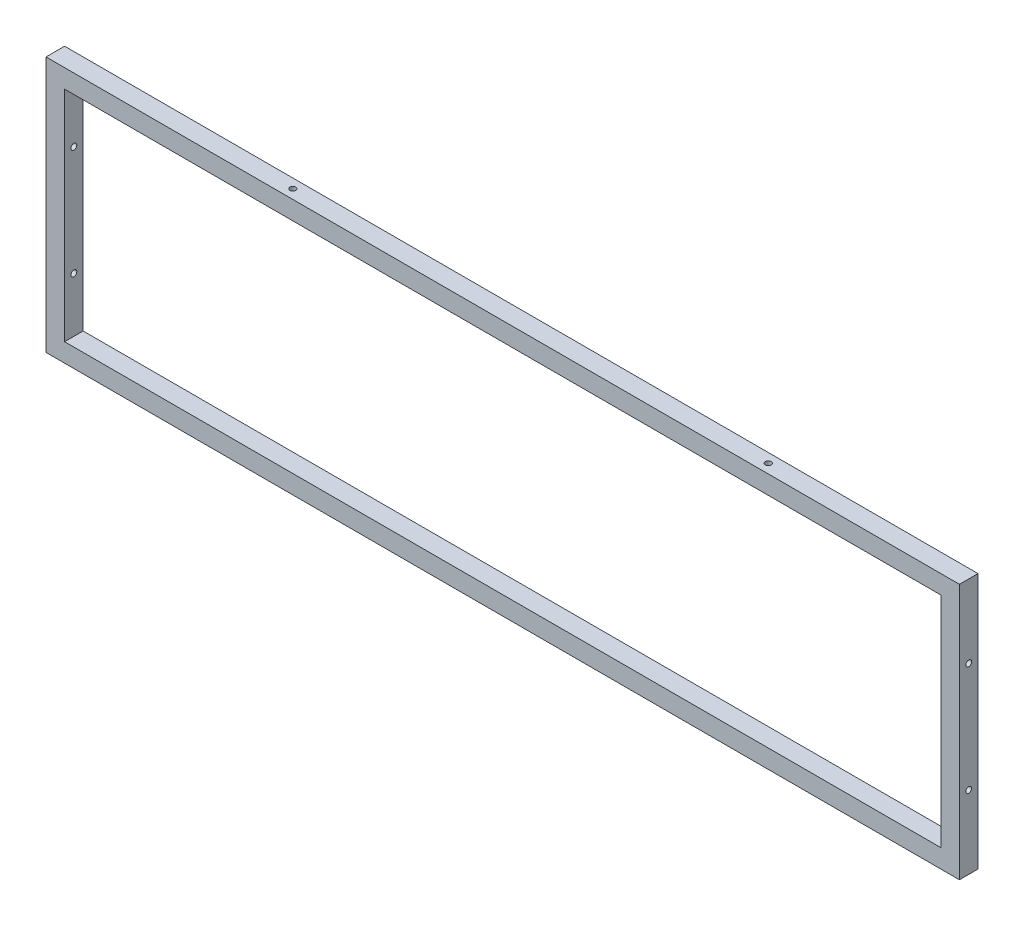
ISO-10303-21;
HEADER;
FILE_DESCRIPTION(('STEP AP214'),'2;1');
FILE_NAME('part.step','',(''),(''),'','','');
FILE_SCHEMA(('AUTOMOTIVE_DESIGN { 1 0 10303 214 1 1 1 1 }'));
ENDSEC;
DATA;
#1=APPLICATION_CONTEXT('core data for automotive mechanical design processes');
#2=APPLICATION_PROTOCOL_DEFINITION('international standard','automotive_design',2000,#1);
#3=PRODUCT_CONTEXT('',#1,'mechanical');
#4=PRODUCT('Part','Part','',(#3));
#5=PRODUCT_RELATED_PRODUCT_CATEGORY('part','',(#4));
#6=PRODUCT_DEFINITION_FORMATION('','',#4);
#7=PRODUCT_DEFINITION_CONTEXT('part definition',#1,'design');
#8=PRODUCT_DEFINITION('design','',#6,#7);
#9=PRODUCT_DEFINITION_SHAPE('','',#8);
#10=(LENGTH_UNIT() NAMED_UNIT(*) SI_UNIT(.MILLI.,.METRE.));
#11=(NAMED_UNIT(*) PLANE_ANGLE_UNIT() SI_UNIT($,.RADIAN.));
#12=(NAMED_UNIT(*) SI_UNIT($,.STERADIAN.) SOLID_ANGLE_UNIT());
#13=UNCERTAINTY_MEASURE_WITH_UNIT(LENGTH_MEASURE(1.E-05),#10,'distance_accuracy_value','');
#14=(GEOMETRIC_REPRESENTATION_CONTEXT(3) GLOBAL_UNCERTAINTY_ASSIGNED_CONTEXT((#13)) GLOBAL_UNIT_ASSIGNED_CONTEXT((#10,
#11,#12)) REPRESENTATION_CONTEXT('',''));
#15=CARTESIAN_POINT('',(0.,0.,0.));
#16=DIRECTION('',(0.,0.,1.));
#17=DIRECTION('',(1.,0.,0.));
#18=AXIS2_PLACEMENT_3D('',#15,#16,#17);
#19=CARTESIAN_POINT('',(0.,0.,-25.4));
#20=DIRECTION('',(-1.,0.,0.));
#21=DIRECTION('',(0.,-1.,0.));
#22=AXIS2_PLACEMENT_3D('',#19,#20,#21);
#23=PLANE('',#22);
#24=CARTESIAN_POINT('',(0.,-100.,-12.7));
#25=DIRECTION('',(1.,0.,0.));
#26=DIRECTION('',(0.,0.,-1.));
#27=AXIS2_PLACEMENT_3D('',#24,#25,#26);
#28=CIRCLE('',#27,4.);
#29=CARTESIAN_POINT('',(0.,-100.,-16.7));
#30=VERTEX_POINT('',#29);
#31=EDGE_CURVE('E172',#30,#30,#28,.T.);
#32=ORIENTED_EDGE('',*,*,#31,.T.);
#33=EDGE_LOOP('',(#32));
#34=FACE_BOUND('',#33,.T.);
#35=CARTESIAN_POINT('',(0.,-250.,-12.7));
#36=DIRECTION('',(1.,0.,0.));
#37=DIRECTION('',(0.,0.,-1.));
#38=AXIS2_PLACEMENT_3D('',#35,#36,#37);
#39=CIRCLE('',#38,4.);
#40=CARTESIAN_POINT('',(0.,-250.,-16.7));
#41=VERTEX_POINT('',#40);
#42=EDGE_CURVE('E179',#41,#41,#39,.T.);
#43=ORIENTED_EDGE('',*,*,#42,.T.);
#44=EDGE_LOOP('',(#43));
#45=FACE_BOUND('',#44,.T.);
#46=DIRECTION('',(0.,-1.,0.));
#47=VECTOR('',#46,1.);
#48=CARTESIAN_POINT('',(0.,0.,0.));
#49=LINE('',#48,#47);
#50=CARTESIAN_POINT('',(0.,0.,0.));
#51=VERTEX_POINT('',#50);
#52=CARTESIAN_POINT('',(0.,-350.,0.));
#53=VERTEX_POINT('',#52);
#54=EDGE_CURVE('E138',#51,#53,#49,.T.);
#55=ORIENTED_EDGE('',*,*,#54,.F.);
#56=DIRECTION('',(0.,0.,1.));
#57=VECTOR('',#56,1.);
#58=CARTESIAN_POINT('',(0.,0.,-25.4));
#59=LINE('',#58,#57);
#60=CARTESIAN_POINT('',(0.,0.,-25.4));
#61=VERTEX_POINT('',#60);
#62=EDGE_CURVE('E11',#61,#51,#59,.T.);
#63=ORIENTED_EDGE('',*,*,#62,.F.);
#64=DIRECTION('',(0.,-1.,0.));
#65=VECTOR('',#64,1.);
#66=CARTESIAN_POINT('',(0.,0.,-25.4));
#67=LINE('',#66,#65);
#68=CARTESIAN_POINT('',(0.,-350.,-25.4));
#69=VERTEX_POINT('',#68);
#70=EDGE_CURVE('E142',#61,#69,#67,.T.);
#71=ORIENTED_EDGE('',*,*,#70,.T.);
#72=DIRECTION('',(0.,0.,1.));
#73=VECTOR('',#72,1.);
#74=CARTESIAN_POINT('',(0.,-350.,-25.4));
#75=LINE('',#74,#73);
#76=EDGE_CURVE('E155',#69,#53,#75,.T.);
#77=ORIENTED_EDGE('',*,*,#76,.T.);
#78=EDGE_LOOP('',(#55,#63,#71,#77));
#79=FACE_BOUND('',#78,.T.);
#80=ADVANCED_FACE('F36',(#34,#45,#79),#23,.T.);
#81=CARTESIAN_POINT('',(0.,0.,-25.4));
#82=DIRECTION('',(0.,1.,0.));
#83=DIRECTION('',(0.,0.,1.));
#84=AXIS2_PLACEMENT_3D('',#81,#82,#83);
#85=PLANE('',#84);
#86=CARTESIAN_POINT('',(325.,0.,-12.7));
#87=DIRECTION('',(0.,1.,0.));
#88=DIRECTION('',(0.,0.,1.));
#89=AXIS2_PLACEMENT_3D('',#86,#87,#88);
#90=CIRCLE('',#89,3.99999999999999);
#91=CARTESIAN_POINT('',(325.,0.,-8.70000000000001));
#92=VERTEX_POINT('',#91);
#93=EDGE_CURVE('E196',#92,#92,#90,.T.);
#94=ORIENTED_EDGE('',*,*,#93,.F.);
#95=EDGE_LOOP('',(#94));
#96=FACE_BOUND('',#95,.T.);
#97=CARTESIAN_POINT('',(975.054095100927,0.,-12.7));
#98=DIRECTION('',(0.,1.,0.));
#99=DIRECTION('',(0.,0.,1.));
#100=AXIS2_PLACEMENT_3D('',#97,#98,#99);
#101=CIRCLE('',#100,3.99999999999999);
#102=CARTESIAN_POINT('',(975.054095100927,0.,-8.70000000000001));
#103=VERTEX_POINT('',#102);
#104=EDGE_CURVE('E198',#103,#103,#101,.T.);
#105=ORIENTED_EDGE('',*,*,#104,.F.);
#106=EDGE_LOOP('',(#105));
#107=FACE_BOUND('',#106,.T.);
#108=DIRECTION('',(-1.,0.,0.));
#109=VECTOR('',#108,1.);
#110=CARTESIAN_POINT('',(0.,0.,0.));
#111=LINE('',#110,#109);
#112=CARTESIAN_POINT('',(1249.2,0.,0.));
#113=VERTEX_POINT('',#112);
#114=EDGE_CURVE('E146',#113,#51,#111,.T.);
#115=ORIENTED_EDGE('',*,*,#114,.F.);
#116=DIRECTION('',(0.,0.,1.));
#117=VECTOR('',#116,1.);
#118=CARTESIAN_POINT('',(1249.2,0.,-25.4));
#119=LINE('',#118,#117);
#120=CARTESIAN_POINT('',(1249.2,0.,-25.4));
#121=VERTEX_POINT('',#120);
#122=EDGE_CURVE('E44',#121,#113,#119,.T.);
#123=ORIENTED_EDGE('',*,*,#122,.F.);
#124=DIRECTION('',(-1.,0.,0.));
#125=VECTOR('',#124,1.);
#126=CARTESIAN_POINT('',(0.,0.,-25.4));
#127=LINE('',#126,#125);
#128=EDGE_CURVE('E152',#121,#61,#127,.T.);
#129=ORIENTED_EDGE('',*,*,#128,.T.);
#130=ORIENTED_EDGE('',*,*,#62,.T.);
#131=EDGE_LOOP('',(#115,#123,#129,#130));
#132=FACE_BOUND('',#131,.T.);
#133=ADVANCED_FACE('F222',(#96,#107,#132),#85,.T.);
#134=CARTESIAN_POINT('',(1249.2,0.,-25.4));
#135=DIRECTION('',(1.,0.,0.));
#136=DIRECTION('',(0.,0.,-1.));
#137=AXIS2_PLACEMENT_3D('',#134,#135,#136);
#138=PLANE('',#137);
#139=CARTESIAN_POINT('',(1249.2,-100.,-12.7));
#140=DIRECTION('',(1.,0.,0.));
#141=DIRECTION('',(0.,0.,-1.));
#142=AXIS2_PLACEMENT_3D('',#139,#140,#141);
#143=CIRCLE('',#142,4.);
#144=CARTESIAN_POINT('',(1249.2,-100.,-16.7));
#145=VERTEX_POINT('',#144);
#146=EDGE_CURVE('E191',#145,#145,#143,.F.);
#147=ORIENTED_EDGE('',*,*,#146,.T.);
#148=EDGE_LOOP('',(#147));
#149=FACE_BOUND('',#148,.T.);
#150=CARTESIAN_POINT('',(1249.2,-250.,-12.7));
#151=DIRECTION('',(1.,0.,0.));
#152=DIRECTION('',(0.,0.,-1.));
#153=AXIS2_PLACEMENT_3D('',#150,#151,#152);
#154=CIRCLE('',#153,4.);
#155=CARTESIAN_POINT('',(1249.2,-250.,-16.7));
#156=VERTEX_POINT('',#155);
#157=EDGE_CURVE('E176',#156,#156,#154,.F.);
#158=ORIENTED_EDGE('',*,*,#157,.T.);
#159=EDGE_LOOP('',(#158));
#160=FACE_BOUND('',#159,.T.);
#161=DIRECTION('',(0.,1.,0.));
#162=VECTOR('',#161,1.);
#163=CARTESIAN_POINT('',(1249.2,0.,0.));
#164=LINE('',#163,#162);
#165=CARTESIAN_POINT('',(1249.2,-350.,0.));
#166=VERTEX_POINT('',#165);
#167=EDGE_CURVE('E161',#166,#113,#164,.T.);
#168=ORIENTED_EDGE('',*,*,#167,.F.);
#169=DIRECTION('',(0.,0.,1.));
#170=VECTOR('',#169,1.);
#171=CARTESIAN_POINT('',(1249.2,-350.,-25.4));
#172=LINE('',#171,#170);
#173=CARTESIAN_POINT('',(1249.2,-350.,-25.4));
#174=VERTEX_POINT('',#173);
#175=EDGE_CURVE('E167',#174,#166,#172,.T.);
#176=ORIENTED_EDGE('',*,*,#175,.F.);
#177=DIRECTION('',(0.,1.,0.));
#178=VECTOR('',#177,1.);
#179=CARTESIAN_POINT('',(1249.2,0.,-25.4));
#180=LINE('',#179,#178);
#181=EDGE_CURVE('E149',#174,#121,#180,.T.);
#182=ORIENTED_EDGE('',*,*,#181,.T.);
#183=ORIENTED_EDGE('',*,*,#122,.T.);
#184=EDGE_LOOP('',(#168,#176,#182,#183));
#185=FACE_BOUND('',#184,.T.);
#186=ADVANCED_FACE('F226',(#149,#160,#185),#138,.T.);
#187=CARTESIAN_POINT('',(0.,-350.,-25.4));
#188=DIRECTION('',(0.,-1.,0.));
#189=DIRECTION('',(0.,0.,-1.));
#190=AXIS2_PLACEMENT_3D('',#187,#188,#189);
#191=PLANE('',#190);
#192=DIRECTION('',(1.,0.,0.));
#193=VECTOR('',#192,1.);
#194=CARTESIAN_POINT('',(0.,-350.,0.));
#195=LINE('',#194,#193);
#196=EDGE_CURVE('E158',#53,#166,#195,.T.);
#197=ORIENTED_EDGE('',*,*,#196,.F.);
#198=ORIENTED_EDGE('',*,*,#76,.F.);
#199=DIRECTION('',(1.,0.,0.));
#200=VECTOR('',#199,1.);
#201=CARTESIAN_POINT('',(0.,-350.,-25.4));
#202=LINE('',#201,#200);
#203=EDGE_CURVE('E145',#69,#174,#202,.T.);
#204=ORIENTED_EDGE('',*,*,#203,.T.);
#205=ORIENTED_EDGE('',*,*,#175,.T.);
#206=EDGE_LOOP('',(#197,#198,#204,#205));
#207=FACE_BOUND('',#206,.T.);
#208=ADVANCED_FACE('F244',(#207),#191,.T.);
#209=CARTESIAN_POINT('',(0.,0.,-25.4));
#210=DIRECTION('',(0.,0.,1.));
#211=DIRECTION('',(1.,0.,0.));
#212=AXIS2_PLACEMENT_3D('',#209,#210,#211);
#213=PLANE('',#212);
#214=DIRECTION('',(0.,1.,0.));
#215=VECTOR('',#214,1.);
#216=CARTESIAN_POINT('',(1223.8,-25.3999999999999,-25.4));
#217=LINE('',#216,#215);
#218=CARTESIAN_POINT('',(1223.8,-324.6,-25.4));
#219=VERTEX_POINT('',#218);
#220=CARTESIAN_POINT('',(1223.8,-25.3999999999999,-25.4));
#221=VERTEX_POINT('',#220);
#222=EDGE_CURVE('E109',#219,#221,#217,.T.);
#223=ORIENTED_EDGE('',*,*,#222,.T.);
#224=DIRECTION('',(-1.,0.,0.));
#225=VECTOR('',#224,1.);
#226=CARTESIAN_POINT('',(1223.8,-25.3999999999999,-25.4));
#227=LINE('',#226,#225);
#228=CARTESIAN_POINT('',(25.4000000000001,-25.4,-25.4));
#229=VERTEX_POINT('',#228);
#230=EDGE_CURVE('E103',#221,#229,#227,.T.);
#231=ORIENTED_EDGE('',*,*,#230,.T.);
#232=DIRECTION('',(0.,-1.,0.));
#233=VECTOR('',#232,1.);
#234=CARTESIAN_POINT('',(25.4000000000001,-324.6,-25.4));
#235=LINE('',#234,#233);
#236=CARTESIAN_POINT('',(25.4000000000001,-324.6,-25.4));
#237=VERTEX_POINT('',#236);
#238=EDGE_CURVE('E112',#229,#237,#235,.T.);
#239=ORIENTED_EDGE('',*,*,#238,.T.);
#240=DIRECTION('',(1.,0.,0.));
#241=VECTOR('',#240,1.);
#242=CARTESIAN_POINT('',(1223.8,-324.6,-25.4));
#243=LINE('',#242,#241);
#244=EDGE_CURVE('E52',#237,#219,#243,.T.);
#245=ORIENTED_EDGE('',*,*,#244,.T.);
#246=EDGE_LOOP('',(#223,#231,#239,#245));
#247=FACE_BOUND('',#246,.T.);
#248=ORIENTED_EDGE('',*,*,#70,.F.);
#249=ORIENTED_EDGE('',*,*,#128,.F.);
#250=ORIENTED_EDGE('',*,*,#181,.F.);
#251=ORIENTED_EDGE('',*,*,#203,.F.);
#252=EDGE_LOOP('',(#248,#249,#250,#251));
#253=FACE_BOUND('',#252,.T.);
#254=ADVANCED_FACE('F116',(#247,#253),#213,.F.);
#255=CARTESIAN_POINT('',(0.,0.,0.));
#256=DIRECTION('',(0.,0.,1.));
#257=DIRECTION('',(1.,0.,0.));
#258=AXIS2_PLACEMENT_3D('',#255,#256,#257);
#259=PLANE('',#258);
#260=DIRECTION('',(-1.,0.,0.));
#261=VECTOR('',#260,1.);
#262=CARTESIAN_POINT('',(1223.8,-25.3999999999999,0.));
#263=LINE('',#262,#261);
#264=CARTESIAN_POINT('',(1223.8,-25.3999999999999,0.));
#265=VERTEX_POINT('',#264);
#266=CARTESIAN_POINT('',(25.4000000000001,-25.4,0.));
#267=VERTEX_POINT('',#266);
#268=EDGE_CURVE('E60',#265,#267,#263,.T.);
#269=ORIENTED_EDGE('',*,*,#268,.F.);
#270=DIRECTION('',(0.,1.,0.));
#271=VECTOR('',#270,1.);
#272=CARTESIAN_POINT('',(1223.8,-25.3999999999999,0.));
#273=LINE('',#272,#271);
#274=CARTESIAN_POINT('',(1223.8,-324.6,0.));
#275=VERTEX_POINT('',#274);
#276=EDGE_CURVE('E119',#275,#265,#273,.T.);
#277=ORIENTED_EDGE('',*,*,#276,.F.);
#278=DIRECTION('',(1.,0.,0.));
#279=VECTOR('',#278,1.);
#280=CARTESIAN_POINT('',(1223.8,-324.6,0.));
#281=LINE('',#280,#279);
#282=CARTESIAN_POINT('',(25.4000000000001,-324.6,0.));
#283=VERTEX_POINT('',#282);
#284=EDGE_CURVE('E122',#283,#275,#281,.T.);
#285=ORIENTED_EDGE('',*,*,#284,.F.);
#286=DIRECTION('',(0.,-1.,0.));
#287=VECTOR('',#286,1.);
#288=CARTESIAN_POINT('',(25.4000000000001,-324.6,0.));
#289=LINE('',#288,#287);
#290=EDGE_CURVE('E131',#267,#283,#289,.T.);
#291=ORIENTED_EDGE('',*,*,#290,.F.);
#292=EDGE_LOOP('',(#269,#277,#285,#291));
#293=FACE_BOUND('',#292,.T.);
#294=ORIENTED_EDGE('',*,*,#54,.T.);
#295=ORIENTED_EDGE('',*,*,#196,.T.);
#296=ORIENTED_EDGE('',*,*,#167,.T.);
#297=ORIENTED_EDGE('',*,*,#114,.T.);
#298=EDGE_LOOP('',(#294,#295,#296,#297));
#299=FACE_BOUND('',#298,.T.);
#300=ADVANCED_FACE('F237',(#293,#299),#259,.T.);
#301=CARTESIAN_POINT('',(1223.8,-25.3999999999999,-25.4));
#302=DIRECTION('',(0.,1.,0.));
#303=DIRECTION('',(-1.,0.,0.));
#304=AXIS2_PLACEMENT_3D('',#301,#302,#303);
#305=PLANE('',#304);
#306=CARTESIAN_POINT('',(325.,-25.4,-12.7));
#307=DIRECTION('',(0.,1.,0.));
#308=DIRECTION('',(0.,0.,1.));
#309=AXIS2_PLACEMENT_3D('',#306,#307,#308);
#310=CIRCLE('',#309,3.99999999999999);
#311=CARTESIAN_POINT('',(325.,-25.4,-8.70000000000001));
#312=VERTEX_POINT('',#311);
#313=EDGE_CURVE('E132',#312,#312,#310,.T.);
#314=ORIENTED_EDGE('',*,*,#313,.T.);
#315=EDGE_LOOP('',(#314));
#316=FACE_BOUND('',#315,.T.);
#317=CARTESIAN_POINT('',(975.054095100927,-25.4,-12.7));
#318=DIRECTION('',(0.,1.,0.));
#319=DIRECTION('',(0.,0.,1.));
#320=AXIS2_PLACEMENT_3D('',#317,#318,#319);
#321=CIRCLE('',#320,3.99999999999999);
#322=CARTESIAN_POINT('',(975.054095100927,-25.4,-8.70000000000001));
#323=VERTEX_POINT('',#322);
#324=EDGE_CURVE('E125',#323,#323,#321,.T.);
#325=ORIENTED_EDGE('',*,*,#324,.T.);
#326=EDGE_LOOP('',(#325));
#327=FACE_BOUND('',#326,.T.);
#328=ORIENTED_EDGE('',*,*,#268,.T.);
#329=DIRECTION('',(0.,0.,1.));
#330=VECTOR('',#329,1.);
#331=CARTESIAN_POINT('',(25.4000000000001,-25.4,-25.4));
#332=LINE('',#331,#330);
#333=EDGE_CURVE('E99',#229,#267,#332,.T.);
#334=ORIENTED_EDGE('',*,*,#333,.F.);
#335=ORIENTED_EDGE('',*,*,#230,.F.);
#336=DIRECTION('',(0.,0.,1.));
#337=VECTOR('',#336,1.);
#338=CARTESIAN_POINT('',(1223.8,-25.3999999999999,-25.4));
#339=LINE('',#338,#337);
#340=EDGE_CURVE('E136',#221,#265,#339,.T.);
#341=ORIENTED_EDGE('',*,*,#340,.T.);
#342=EDGE_LOOP('',(#328,#334,#335,#341));
#343=FACE_BOUND('',#342,.T.);
#344=ADVANCED_FACE('F101',(#316,#327,#343),#305,.F.);
#345=CARTESIAN_POINT('',(1223.8,-25.3999999999999,-25.4));
#346=DIRECTION('',(1.,0.,0.));
#347=DIRECTION('',(0.,0.,-1.));
#348=AXIS2_PLACEMENT_3D('',#345,#346,#347);
#349=PLANE('',#348);
#350=CARTESIAN_POINT('',(1223.8,-100.,-12.7));
#351=DIRECTION('',(1.,0.,0.));
#352=DIRECTION('',(0.,0.,-1.));
#353=AXIS2_PLACEMENT_3D('',#350,#351,#352);
#354=CIRCLE('',#353,4.);
#355=CARTESIAN_POINT('',(1223.8,-100.,-16.7));
#356=VERTEX_POINT('',#355);
#357=EDGE_CURVE('E188',#356,#356,#354,.F.);
#358=ORIENTED_EDGE('',*,*,#357,.F.);
#359=EDGE_LOOP('',(#358));
#360=FACE_BOUND('',#359,.T.);
#361=CARTESIAN_POINT('',(1223.8,-250.,-12.7));
#362=DIRECTION('',(1.,0.,0.));
#363=DIRECTION('',(0.,0.,-1.));
#364=AXIS2_PLACEMENT_3D('',#361,#362,#363);
#365=CIRCLE('',#364,4.);
#366=CARTESIAN_POINT('',(1223.8,-250.,-16.7));
#367=VERTEX_POINT('',#366);
#368=EDGE_CURVE('E171',#367,#367,#365,.F.);
#369=ORIENTED_EDGE('',*,*,#368,.F.);
#370=EDGE_LOOP('',(#369));
#371=FACE_BOUND('',#370,.T.);
#372=ORIENTED_EDGE('',*,*,#276,.T.);
#373=ORIENTED_EDGE('',*,*,#340,.F.);
#374=ORIENTED_EDGE('',*,*,#222,.F.);
#375=DIRECTION('',(0.,0.,1.));
#376=VECTOR('',#375,1.);
#377=CARTESIAN_POINT('',(1223.8,-324.6,-25.4));
#378=LINE('',#377,#376);
#379=EDGE_CURVE('E139',#219,#275,#378,.T.);
#380=ORIENTED_EDGE('',*,*,#379,.T.);
#381=EDGE_LOOP('',(#372,#373,#374,#380));
#382=FACE_BOUND('',#381,.T.);
#383=ADVANCED_FACE('F260',(#360,#371,#382),#349,.F.);
#384=CARTESIAN_POINT('',(1223.8,-324.6,-25.4));
#385=DIRECTION('',(0.,-1.,0.));
#386=DIRECTION('',(1.,0.,0.));
#387=AXIS2_PLACEMENT_3D('',#384,#385,#386);
#388=PLANE('',#387);
#389=ORIENTED_EDGE('',*,*,#284,.T.);
#390=ORIENTED_EDGE('',*,*,#379,.F.);
#391=ORIENTED_EDGE('',*,*,#244,.F.);
#392=DIRECTION('',(0.,0.,1.));
#393=VECTOR('',#392,1.);
#394=CARTESIAN_POINT('',(25.4000000000001,-324.6,-25.4));
#395=LINE('',#394,#393);
#396=EDGE_CURVE('E108',#237,#283,#395,.T.);
#397=ORIENTED_EDGE('',*,*,#396,.T.);
#398=EDGE_LOOP('',(#389,#390,#391,#397));
#399=FACE_BOUND('',#398,.T.);
#400=ADVANCED_FACE('F217',(#399),#388,.F.);
#401=CARTESIAN_POINT('',(25.4000000000001,-324.6,-25.4));
#402=DIRECTION('',(-1.,0.,0.));
#403=DIRECTION('',(0.,0.,1.));
#404=AXIS2_PLACEMENT_3D('',#401,#402,#403);
#405=PLANE('',#404);
#406=CARTESIAN_POINT('',(25.4000000000003,-100.,-12.7));
#407=DIRECTION('',(-1.,0.,0.));
#408=DIRECTION('',(0.,0.,1.));
#409=AXIS2_PLACEMENT_3D('',#406,#407,#408);
#410=CIRCLE('',#409,4.);
#411=CARTESIAN_POINT('',(25.4000000000003,-100.,-8.7));
#412=VERTEX_POINT('',#411);
#413=EDGE_CURVE('E39',#412,#412,#410,.F.);
#414=ORIENTED_EDGE('',*,*,#413,.F.);
#415=EDGE_LOOP('',(#414));
#416=FACE_BOUND('',#415,.T.);
#417=CARTESIAN_POINT('',(25.4000000000003,-250.,-12.7));
#418=DIRECTION('',(-1.,0.,0.));
#419=DIRECTION('',(0.,0.,1.));
#420=AXIS2_PLACEMENT_3D('',#417,#418,#419);
#421=CIRCLE('',#420,4.);
#422=CARTESIAN_POINT('',(25.4000000000003,-250.,-8.7));
#423=VERTEX_POINT('',#422);
#424=EDGE_CURVE('E169',#423,#423,#421,.F.);
#425=ORIENTED_EDGE('',*,*,#424,.F.);
#426=EDGE_LOOP('',(#425));
#427=FACE_BOUND('',#426,.T.);
#428=ORIENTED_EDGE('',*,*,#290,.T.);
#429=ORIENTED_EDGE('',*,*,#396,.F.);
#430=ORIENTED_EDGE('',*,*,#238,.F.);
#431=ORIENTED_EDGE('',*,*,#333,.T.);
#432=EDGE_LOOP('',(#428,#429,#430,#431));
#433=FACE_BOUND('',#432,.T.);
#434=ADVANCED_FACE('F113',(#416,#427,#433),#405,.F.);
#435=CARTESIAN_POINT('',(975.054095100927,-25.4,-12.7));
#436=DIRECTION('',(0.,1.,0.));
#437=DIRECTION('',(0.,0.,1.));
#438=AXIS2_PLACEMENT_3D('',#435,#436,#437);
#439=CYLINDRICAL_SURFACE('',#438,3.99999999999999);
#440=ORIENTED_EDGE('',*,*,#324,.F.);
#441=EDGE_LOOP('',(#440));
#442=FACE_BOUND('',#441,.T.);
#443=ORIENTED_EDGE('',*,*,#104,.T.);
#444=EDGE_LOOP('',(#443));
#445=FACE_BOUND('',#444,.T.);
#446=ADVANCED_FACE('F206',(#442,#445),#439,.F.);
#447=CARTESIAN_POINT('',(325.,-25.4,-12.7));
#448=DIRECTION('',(0.,1.,0.));
#449=DIRECTION('',(0.,0.,1.));
#450=AXIS2_PLACEMENT_3D('',#447,#448,#449);
#451=CYLINDRICAL_SURFACE('',#450,3.99999999999999);
#452=ORIENTED_EDGE('',*,*,#313,.F.);
#453=EDGE_LOOP('',(#452));
#454=FACE_BOUND('',#453,.T.);
#455=ORIENTED_EDGE('',*,*,#93,.T.);
#456=EDGE_LOOP('',(#455));
#457=FACE_BOUND('',#456,.T.);
#458=ADVANCED_FACE('F208',(#454,#457),#451,.F.);
#459=CARTESIAN_POINT('',(5341.4,-250.,-12.7));
#460=DIRECTION('',(-1.,0.,0.));
#461=DIRECTION('',(0.,0.,1.));
#462=AXIS2_PLACEMENT_3D('',#459,#460,#461);
#463=CYLINDRICAL_SURFACE('',#462,4.);
#464=ORIENTED_EDGE('',*,*,#42,.F.);
#465=EDGE_LOOP('',(#464));
#466=FACE_BOUND('',#465,.T.);
#467=ORIENTED_EDGE('',*,*,#424,.T.);
#468=EDGE_LOOP('',(#467));
#469=FACE_BOUND('',#468,.T.);
#470=ADVANCED_FACE('F214',(#466,#469),#463,.F.);
#471=CARTESIAN_POINT('',(5341.4,-100.,-12.7));
#472=DIRECTION('',(-1.,0.,0.));
#473=DIRECTION('',(0.,0.,1.));
#474=AXIS2_PLACEMENT_3D('',#471,#472,#473);
#475=CYLINDRICAL_SURFACE('',#474,4.);
#476=ORIENTED_EDGE('',*,*,#31,.F.);
#477=EDGE_LOOP('',(#476));
#478=FACE_BOUND('',#477,.T.);
#479=ORIENTED_EDGE('',*,*,#413,.T.);
#480=EDGE_LOOP('',(#479));
#481=FACE_BOUND('',#480,.T.);
#482=ADVANCED_FACE('F278',(#478,#481),#475,.F.);
#483=ORIENTED_EDGE('',*,*,#157,.F.);
#484=EDGE_LOOP('',(#483));
#485=FACE_BOUND('',#484,.T.);
#486=ORIENTED_EDGE('',*,*,#368,.T.);
#487=EDGE_LOOP('',(#486));
#488=FACE_BOUND('',#487,.T.);
#489=ADVANCED_FACE('F275',(#485,#488),#463,.F.);
#490=ORIENTED_EDGE('',*,*,#146,.F.);
#491=EDGE_LOOP('',(#490));
#492=FACE_BOUND('',#491,.T.);
#493=ORIENTED_EDGE('',*,*,#357,.T.);
#494=EDGE_LOOP('',(#493));
#495=FACE_BOUND('',#494,.T.);
#496=ADVANCED_FACE('F277',(#492,#495),#475,.F.);
#497=CLOSED_SHELL('',(#80,#133,#186,#208,#254,#300,#344,#383,#400,#434,#446,#458,#470,#482,#489,#496));
#498=MANIFOLD_SOLID_BREP('B2',#497);
#499=ADVANCED_BREP_SHAPE_REPRESENTATION('',(#18,#498),#14);
#500=SHAPE_DEFINITION_REPRESENTATION(#9,#499);
ENDSEC;
END-ISO-10303-21;
